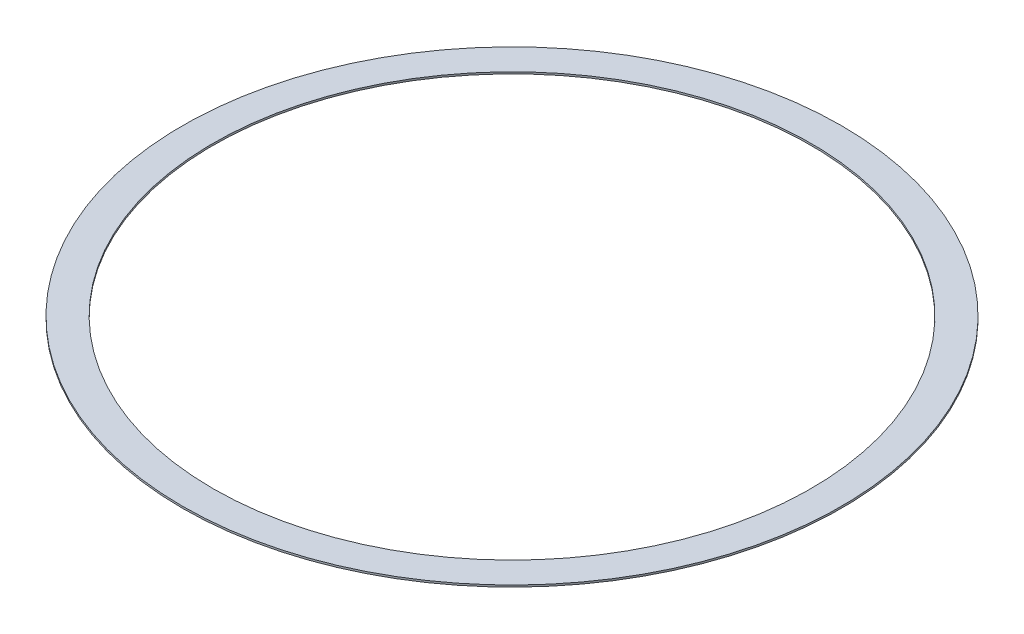
ISO-10303-21;
HEADER;
FILE_DESCRIPTION(('STEP AP214'),'2;1');
FILE_NAME('part.step','',(''),(''),'','','');
FILE_SCHEMA(('AUTOMOTIVE_DESIGN { 1 0 10303 214 1 1 1 1 }'));
ENDSEC;
DATA;
#1=APPLICATION_CONTEXT('core data for automotive mechanical design processes');
#2=APPLICATION_PROTOCOL_DEFINITION('international standard','automotive_design',2000,#1);
#3=PRODUCT_CONTEXT('',#1,'mechanical');
#4=PRODUCT('Part','Part','',(#3));
#5=PRODUCT_RELATED_PRODUCT_CATEGORY('part','',(#4));
#6=PRODUCT_DEFINITION_FORMATION('','',#4);
#7=PRODUCT_DEFINITION_CONTEXT('part definition',#1,'design');
#8=PRODUCT_DEFINITION('design','',#6,#7);
#9=PRODUCT_DEFINITION_SHAPE('','',#8);
#10=(LENGTH_UNIT() NAMED_UNIT(*) SI_UNIT(.MILLI.,.METRE.));
#11=(NAMED_UNIT(*) PLANE_ANGLE_UNIT() SI_UNIT($,.RADIAN.));
#12=(NAMED_UNIT(*) SI_UNIT($,.STERADIAN.) SOLID_ANGLE_UNIT());
#13=UNCERTAINTY_MEASURE_WITH_UNIT(LENGTH_MEASURE(1.E-05),#10,'distance_accuracy_value','');
#14=(GEOMETRIC_REPRESENTATION_CONTEXT(3) GLOBAL_UNCERTAINTY_ASSIGNED_CONTEXT((#13)) GLOBAL_UNIT_ASSIGNED_CONTEXT((#10,
#11,#12)) REPRESENTATION_CONTEXT('',''));
#15=CARTESIAN_POINT('',(0.,0.,0.));
#16=DIRECTION('',(0.,0.,1.));
#17=DIRECTION('',(1.,0.,0.));
#18=AXIS2_PLACEMENT_3D('',#15,#16,#17);
#19=CARTESIAN_POINT('',(0.,3.,0.));
#20=DIRECTION('',(0.,1.,0.));
#21=DIRECTION('',(0.,0.,1.));
#22=AXIS2_PLACEMENT_3D('',#19,#20,#21);
#23=PLANE('',#22);
#24=CARTESIAN_POINT('',(0.,3.,0.));
#25=DIRECTION('',(0.,1.,0.));
#26=DIRECTION('',(0.,0.,1.));
#27=AXIS2_PLACEMENT_3D('',#24,#25,#26);
#28=CIRCLE('',#27,540.);
#29=CARTESIAN_POINT('',(0.,3.,540.));
#30=VERTEX_POINT('',#29);
#31=EDGE_CURVE('E10',#30,#30,#28,.T.);
#32=ORIENTED_EDGE('',*,*,#31,.T.);
#33=EDGE_LOOP('',(#32));
#34=FACE_BOUND('',#33,.T.);
#35=CARTESIAN_POINT('',(0.,3.,0.));
#36=DIRECTION('',(0.,1.,0.));
#37=DIRECTION('',(0.,0.,1.));
#38=AXIS2_PLACEMENT_3D('',#35,#36,#37);
#39=CIRCLE('',#38,490.);
#40=CARTESIAN_POINT('',(0.,3.,490.));
#41=VERTEX_POINT('',#40);
#42=EDGE_CURVE('E41',#41,#41,#39,.T.);
#43=ORIENTED_EDGE('',*,*,#42,.F.);
#44=EDGE_LOOP('',(#43));
#45=FACE_BOUND('',#44,.T.);
#46=ADVANCED_FACE('F30',(#34,#45),#23,.T.);
#47=CARTESIAN_POINT('',(0.,0.,0.));
#48=DIRECTION('',(0.,1.,0.));
#49=DIRECTION('',(0.,0.,1.));
#50=AXIS2_PLACEMENT_3D('',#47,#48,#49);
#51=PLANE('',#50);
#52=CARTESIAN_POINT('',(0.,0.,0.));
#53=DIRECTION('',(0.,1.,0.));
#54=DIRECTION('',(0.,0.,1.));
#55=AXIS2_PLACEMENT_3D('',#52,#53,#54);
#56=CIRCLE('',#55,540.);
#57=CARTESIAN_POINT('',(0.,0.,540.));
#58=VERTEX_POINT('',#57);
#59=EDGE_CURVE('E34',#58,#58,#56,.T.);
#60=ORIENTED_EDGE('',*,*,#59,.F.);
#61=EDGE_LOOP('',(#60));
#62=FACE_BOUND('',#61,.T.);
#63=CARTESIAN_POINT('',(0.,0.,0.));
#64=DIRECTION('',(0.,1.,0.));
#65=DIRECTION('',(0.,0.,1.));
#66=AXIS2_PLACEMENT_3D('',#63,#64,#65);
#67=CIRCLE('',#66,490.);
#68=CARTESIAN_POINT('',(0.,0.,490.));
#69=VERTEX_POINT('',#68);
#70=EDGE_CURVE('E43',#69,#69,#67,.T.);
#71=ORIENTED_EDGE('',*,*,#70,.T.);
#72=EDGE_LOOP('',(#71));
#73=FACE_BOUND('',#72,.T.);
#74=ADVANCED_FACE('F53',(#62,#73),#51,.F.);
#75=CARTESIAN_POINT('',(0.,3.,0.));
#76=DIRECTION('',(0.,-1.,0.));
#77=DIRECTION('',(0.,0.,-1.));
#78=AXIS2_PLACEMENT_3D('',#75,#76,#77);
#79=CYLINDRICAL_SURFACE('',#78,540.);
#80=ORIENTED_EDGE('',*,*,#31,.F.);
#81=EDGE_LOOP('',(#80));
#82=FACE_BOUND('',#81,.T.);
#83=ORIENTED_EDGE('',*,*,#59,.T.);
#84=EDGE_LOOP('',(#83));
#85=FACE_BOUND('',#84,.T.);
#86=ADVANCED_FACE('F32',(#82,#85),#79,.T.);
#87=CARTESIAN_POINT('',(0.,3.,0.));
#88=DIRECTION('',(0.,-1.,0.));
#89=DIRECTION('',(0.,0.,-1.));
#90=AXIS2_PLACEMENT_3D('',#87,#88,#89);
#91=CYLINDRICAL_SURFACE('',#90,490.);
#92=ORIENTED_EDGE('',*,*,#42,.T.);
#93=EDGE_LOOP('',(#92));
#94=FACE_BOUND('',#93,.T.);
#95=ORIENTED_EDGE('',*,*,#70,.F.);
#96=EDGE_LOOP('',(#95));
#97=FACE_BOUND('',#96,.T.);
#98=ADVANCED_FACE('F49',(#94,#97),#91,.F.);
#99=CLOSED_SHELL('',(#46,#74,#86,#98));
#100=MANIFOLD_SOLID_BREP('B2',#99);
#101=ADVANCED_BREP_SHAPE_REPRESENTATION('',(#18,#100),#14);
#102=SHAPE_DEFINITION_REPRESENTATION(#9,#101);
ENDSEC;
END-ISO-10303-21;
